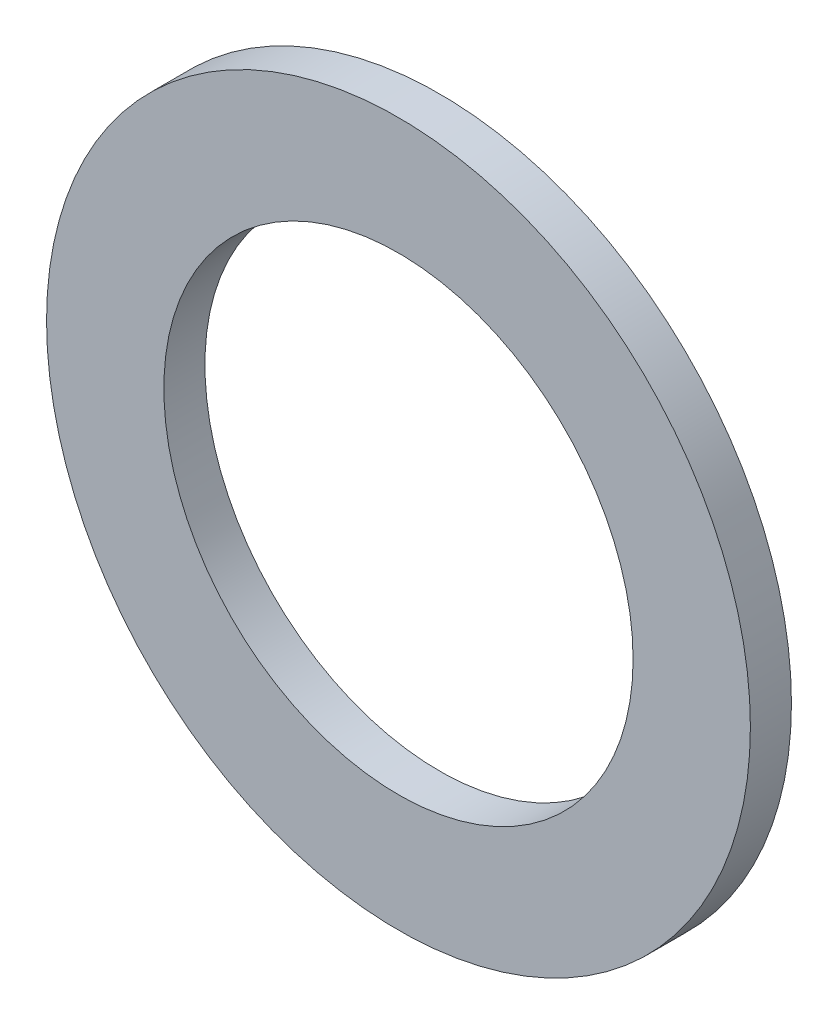
ISO-10303-21;
HEADER;
FILE_DESCRIPTION(('STEP AP214'),'2;1');
FILE_NAME('part.step','',(''),(''),'','','');
FILE_SCHEMA(('AUTOMOTIVE_DESIGN { 1 0 10303 214 1 1 1 1 }'));
ENDSEC;
DATA;
#1=APPLICATION_CONTEXT('core data for automotive mechanical design processes');
#2=APPLICATION_PROTOCOL_DEFINITION('international standard','automotive_design',2000,#1);
#3=PRODUCT_CONTEXT('',#1,'mechanical');
#4=PRODUCT('Part','Part','',(#3));
#5=PRODUCT_RELATED_PRODUCT_CATEGORY('part','',(#4));
#6=PRODUCT_DEFINITION_FORMATION('','',#4);
#7=PRODUCT_DEFINITION_CONTEXT('part definition',#1,'design');
#8=PRODUCT_DEFINITION('design','',#6,#7);
#9=PRODUCT_DEFINITION_SHAPE('','',#8);
#10=(LENGTH_UNIT() NAMED_UNIT(*) SI_UNIT(.MILLI.,.METRE.));
#11=(NAMED_UNIT(*) PLANE_ANGLE_UNIT() SI_UNIT($,.RADIAN.));
#12=(NAMED_UNIT(*) SI_UNIT($,.STERADIAN.) SOLID_ANGLE_UNIT());
#13=UNCERTAINTY_MEASURE_WITH_UNIT(LENGTH_MEASURE(1.E-05),#10,'distance_accuracy_value','');
#14=(GEOMETRIC_REPRESENTATION_CONTEXT(3) GLOBAL_UNCERTAINTY_ASSIGNED_CONTEXT((#13)) GLOBAL_UNIT_ASSIGNED_CONTEXT((#10,
#11,#12)) REPRESENTATION_CONTEXT('',''));
#15=CARTESIAN_POINT('',(0.,0.,0.));
#16=DIRECTION('',(0.,0.,1.));
#17=DIRECTION('',(1.,0.,0.));
#18=AXIS2_PLACEMENT_3D('',#15,#16,#17);
#19=CARTESIAN_POINT('',(0.,0.,3.5));
#20=DIRECTION('',(0.,0.,1.));
#21=DIRECTION('',(1.,0.,0.));
#22=AXIS2_PLACEMENT_3D('',#19,#20,#21);
#23=PLANE('',#22);
#24=CARTESIAN_POINT('',(0.,0.,3.5));
#25=DIRECTION('',(0.,0.,1.));
#26=DIRECTION('',(1.,0.,0.));
#27=AXIS2_PLACEMENT_3D('',#24,#25,#26);
#28=CIRCLE('',#27,30.);
#29=CARTESIAN_POINT('',(30.,0.,3.5));
#30=VERTEX_POINT('',#29);
#31=EDGE_CURVE('E10',#30,#30,#28,.T.);
#32=ORIENTED_EDGE('',*,*,#31,.T.);
#33=EDGE_LOOP('',(#32));
#34=FACE_BOUND('',#33,.T.);
#35=CARTESIAN_POINT('',(0.,0.,3.5));
#36=DIRECTION('',(0.,0.,1.));
#37=DIRECTION('',(1.,0.,0.));
#38=AXIS2_PLACEMENT_3D('',#35,#36,#37);
#39=CIRCLE('',#38,20.);
#40=CARTESIAN_POINT('',(20.,0.,3.5));
#41=VERTEX_POINT('',#40);
#42=EDGE_CURVE('E59',#41,#41,#39,.T.);
#43=ORIENTED_EDGE('',*,*,#42,.F.);
#44=EDGE_LOOP('',(#43));
#45=FACE_BOUND('',#44,.T.);
#46=ADVANCED_FACE('F45',(#34,#45),#23,.T.);
#47=CARTESIAN_POINT('',(0.,0.,0.));
#48=DIRECTION('',(0.,0.,1.));
#49=DIRECTION('',(1.,0.,0.));
#50=AXIS2_PLACEMENT_3D('',#47,#48,#49);
#51=PLANE('',#50);
#52=CARTESIAN_POINT('',(0.,0.,0.));
#53=DIRECTION('',(0.,0.,1.));
#54=DIRECTION('',(1.,0.,0.));
#55=AXIS2_PLACEMENT_3D('',#52,#53,#54);
#56=CIRCLE('',#55,30.);
#57=CARTESIAN_POINT('',(30.,0.,0.));
#58=VERTEX_POINT('',#57);
#59=EDGE_CURVE('E49',#58,#58,#56,.T.);
#60=ORIENTED_EDGE('',*,*,#59,.F.);
#61=EDGE_LOOP('',(#60));
#62=FACE_BOUND('',#61,.T.);
#63=CARTESIAN_POINT('',(0.,0.,0.));
#64=DIRECTION('',(0.,0.,1.));
#65=DIRECTION('',(1.,0.,0.));
#66=AXIS2_PLACEMENT_3D('',#63,#64,#65);
#67=CIRCLE('',#66,20.);
#68=CARTESIAN_POINT('',(20.,0.,0.));
#69=VERTEX_POINT('',#68);
#70=EDGE_CURVE('E61',#69,#69,#67,.T.);
#71=ORIENTED_EDGE('',*,*,#70,.T.);
#72=EDGE_LOOP('',(#71));
#73=FACE_BOUND('',#72,.T.);
#74=ADVANCED_FACE('F72',(#62,#73),#51,.F.);
#75=CARTESIAN_POINT('',(0.,0.,3.5));
#76=DIRECTION('',(0.,0.,-1.));
#77=DIRECTION('',(-1.,0.,0.));
#78=AXIS2_PLACEMENT_3D('',#75,#76,#77);
#79=CYLINDRICAL_SURFACE('',#78,30.);
#80=ORIENTED_EDGE('',*,*,#31,.F.);
#81=EDGE_LOOP('',(#80));
#82=FACE_BOUND('',#81,.T.);
#83=ORIENTED_EDGE('',*,*,#59,.T.);
#84=EDGE_LOOP('',(#83));
#85=FACE_BOUND('',#84,.T.);
#86=ADVANCED_FACE('F47',(#82,#85),#79,.T.);
#87=CARTESIAN_POINT('',(0.,0.,3.5));
#88=DIRECTION('',(0.,0.,-1.));
#89=DIRECTION('',(-1.,0.,0.));
#90=AXIS2_PLACEMENT_3D('',#87,#88,#89);
#91=CYLINDRICAL_SURFACE('',#90,20.);
#92=ORIENTED_EDGE('',*,*,#42,.T.);
#93=EDGE_LOOP('',(#92));
#94=FACE_BOUND('',#93,.T.);
#95=ORIENTED_EDGE('',*,*,#70,.F.);
#96=EDGE_LOOP('',(#95));
#97=FACE_BOUND('',#96,.T.);
#98=ADVANCED_FACE('F68',(#94,#97),#91,.F.);
#99=CLOSED_SHELL('',(#46,#74,#86,#98));
#100=MANIFOLD_SOLID_BREP('B2',#99);
#101=ADVANCED_BREP_SHAPE_REPRESENTATION('',(#18,#100),#14);
#102=SHAPE_DEFINITION_REPRESENTATION(#9,#101);
ENDSEC;
END-ISO-10303-21;
